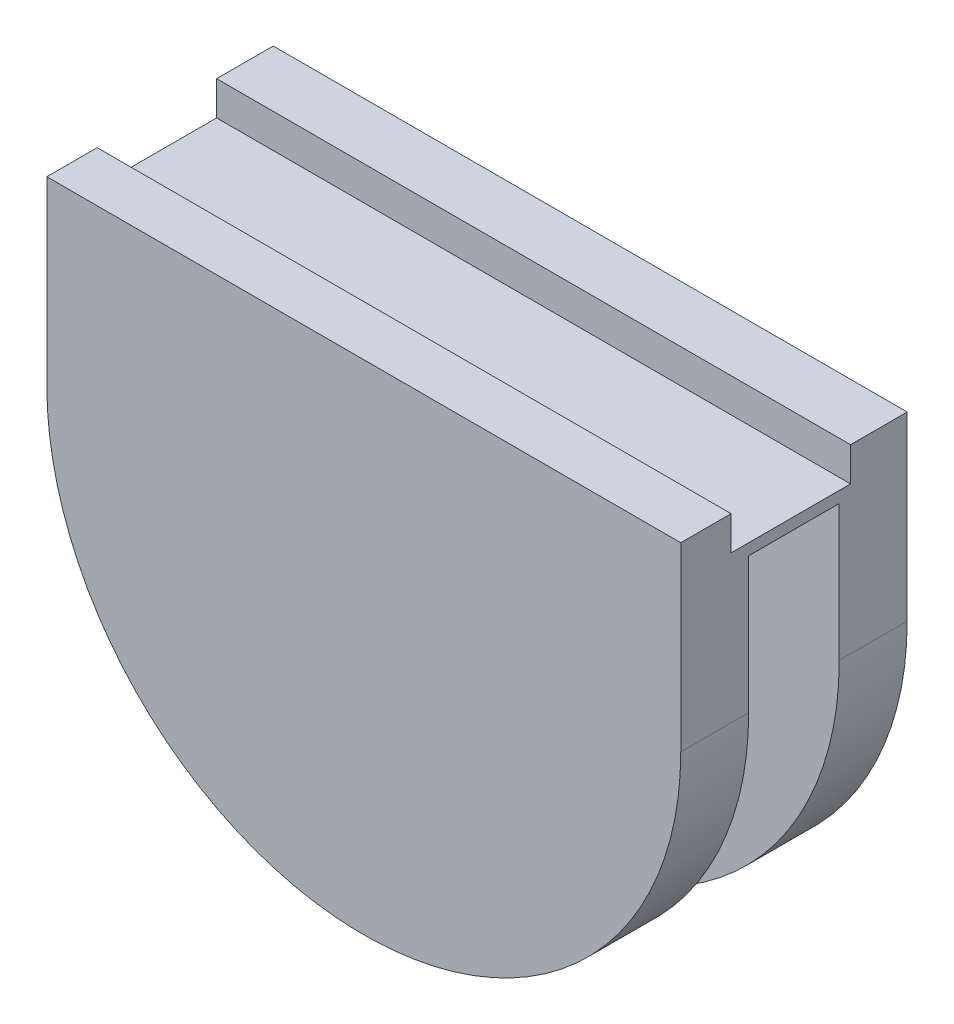
ISO-10303-21;
HEADER;
FILE_DESCRIPTION(('STEP AP214'),'2;1');
FILE_NAME('part.step','',(''),(''),'','','');
FILE_SCHEMA(('AUTOMOTIVE_DESIGN { 1 0 10303 214 1 1 1 1 }'));
ENDSEC;
DATA;
#1=APPLICATION_CONTEXT('core data for automotive mechanical design processes');
#2=APPLICATION_PROTOCOL_DEFINITION('international standard','automotive_design',2000,#1);
#3=PRODUCT_CONTEXT('',#1,'mechanical');
#4=PRODUCT('Part','Part','',(#3));
#5=PRODUCT_RELATED_PRODUCT_CATEGORY('part','',(#4));
#6=PRODUCT_DEFINITION_FORMATION('','',#4);
#7=PRODUCT_DEFINITION_CONTEXT('part definition',#1,'design');
#8=PRODUCT_DEFINITION('design','',#6,#7);
#9=PRODUCT_DEFINITION_SHAPE('','',#8);
#10=(LENGTH_UNIT() NAMED_UNIT(*) SI_UNIT(.MILLI.,.METRE.));
#11=(NAMED_UNIT(*) PLANE_ANGLE_UNIT() SI_UNIT($,.RADIAN.));
#12=(NAMED_UNIT(*) SI_UNIT($,.STERADIAN.) SOLID_ANGLE_UNIT());
#13=UNCERTAINTY_MEASURE_WITH_UNIT(LENGTH_MEASURE(1.E-05),#10,'distance_accuracy_value','');
#14=(GEOMETRIC_REPRESENTATION_CONTEXT(3) GLOBAL_UNCERTAINTY_ASSIGNED_CONTEXT((#13)) GLOBAL_UNIT_ASSIGNED_CONTEXT((#10,
#11,#12)) REPRESENTATION_CONTEXT('',''));
#15=CARTESIAN_POINT('',(0.,0.,0.));
#16=DIRECTION('',(0.,0.,1.));
#17=DIRECTION('',(1.,0.,0.));
#18=AXIS2_PLACEMENT_3D('',#15,#16,#17);
#19=CARTESIAN_POINT('',(-26.0744927753238,2.89196675900277,3.));
#20=DIRECTION('',(0.,-1.,0.));
#21=DIRECTION('',(0.,0.,-1.));
#22=AXIS2_PLACEMENT_3D('',#19,#20,#21);
#23=PLANE('',#22);
#24=DIRECTION('',(0.,0.,-1.));
#25=VECTOR('',#24,1.);
#26=CARTESIAN_POINT('',(-26.0744927753238,2.89196675900277,3.));
#27=LINE('',#26,#25);
#28=CARTESIAN_POINT('',(-26.0744927753238,2.89196675900277,-4.5));
#29=VERTEX_POINT('',#28);
#30=CARTESIAN_POINT('',(-26.0744927753238,2.89196675900277,-7.));
#31=VERTEX_POINT('',#30);
#32=EDGE_CURVE('E215',#29,#31,#27,.T.);
#33=ORIENTED_EDGE('',*,*,#32,.F.);
#34=DIRECTION('',(-1.,0.,0.));
#35=VECTOR('',#34,1.);
#36=CARTESIAN_POINT('',(-26.0744927753238,2.89196675900277,-4.5));
#37=LINE('',#36,#35);
#38=CARTESIAN_POINT('',(1.9255072246762,2.89196675900277,-4.5));
#39=VERTEX_POINT('',#38);
#40=EDGE_CURVE('E141',#39,#29,#37,.T.);
#41=ORIENTED_EDGE('',*,*,#40,.F.);
#42=DIRECTION('',(0.,0.,-1.));
#43=VECTOR('',#42,1.);
#44=CARTESIAN_POINT('',(1.9255072246762,2.89196675900277,3.));
#45=LINE('',#44,#43);
#46=CARTESIAN_POINT('',(1.9255072246762,2.89196675900277,-7.));
#47=VERTEX_POINT('',#46);
#48=EDGE_CURVE('E222',#39,#47,#45,.T.);
#49=ORIENTED_EDGE('',*,*,#48,.T.);
#50=DIRECTION('',(1.,0.,0.));
#51=VECTOR('',#50,1.);
#52=CARTESIAN_POINT('',(1.9255072246762,2.89196675900277,-7.));
#53=LINE('',#52,#51);
#54=EDGE_CURVE('E180',#31,#47,#53,.T.);
#55=ORIENTED_EDGE('',*,*,#54,.F.);
#56=EDGE_LOOP('',(#33,#41,#49,#55));
#57=FACE_BOUND('',#56,.T.);
#58=ADVANCED_FACE('F46',(#57),#23,.F.);
#59=CARTESIAN_POINT('',(-12.0744927753238,-5.10803324099723,0.));
#60=DIRECTION('',(0.,0.,1.));
#61=DIRECTION('',(1.,0.,0.));
#62=AXIS2_PLACEMENT_3D('',#59,#60,#61);
#63=PLANE('',#62);
#64=DIRECTION('',(-1.,0.,0.));
#65=VECTOR('',#64,1.);
#66=CARTESIAN_POINT('',(1.9255072246762,0.891966759002768,0.));
#67=LINE('',#66,#65);
#68=CARTESIAN_POINT('',(1.9255072246762,0.891966759002769,0.));
#69=VERTEX_POINT('',#68);
#70=CARTESIAN_POINT('',(-26.0744927753238,0.891966759002769,0.));
#71=VERTEX_POINT('',#70);
#72=EDGE_CURVE('E69',#69,#71,#67,.T.);
#73=ORIENTED_EDGE('',*,*,#72,.F.);
#74=DIRECTION('',(0.,1.,0.));
#75=VECTOR('',#74,1.);
#76=CARTESIAN_POINT('',(1.9255072246762,2.89196675900277,0.));
#77=LINE('',#76,#75);
#78=CARTESIAN_POINT('',(1.9255072246762,-5.10803324099723,0.));
#79=VERTEX_POINT('',#78);
#80=EDGE_CURVE('E209',#79,#69,#77,.T.);
#81=ORIENTED_EDGE('',*,*,#80,.F.);
#82=CARTESIAN_POINT('',(-12.0744927753238,-5.10803324099723,0.));
#83=DIRECTION('',(0.,0.,1.));
#84=DIRECTION('',(1.,0.,0.));
#85=AXIS2_PLACEMENT_3D('',#82,#83,#84);
#86=CIRCLE('',#85,14.);
#87=CARTESIAN_POINT('',(-26.0744927753238,-5.10803324099723,0.));
#88=VERTEX_POINT('',#87);
#89=EDGE_CURVE('E217',#88,#79,#86,.T.);
#90=ORIENTED_EDGE('',*,*,#89,.F.);
#91=DIRECTION('',(0.,-1.,0.));
#92=VECTOR('',#91,1.);
#93=CARTESIAN_POINT('',(-26.0744927753238,-5.10803324099724,0.));
#94=LINE('',#93,#92);
#95=EDGE_CURVE('E204',#71,#88,#94,.T.);
#96=ORIENTED_EDGE('',*,*,#95,.F.);
#97=EDGE_LOOP('',(#73,#81,#90,#96));
#98=FACE_BOUND('',#97,.T.);
#99=ADVANCED_FACE('F234',(#98),#63,.F.);
#100=CARTESIAN_POINT('',(-26.0744927753238,-5.10803324099724,3.));
#101=DIRECTION('',(1.,0.,0.));
#102=DIRECTION('',(0.,0.,-1.));
#103=AXIS2_PLACEMENT_3D('',#100,#101,#102);
#104=PLANE('',#103);
#105=DIRECTION('',(0.,0.,1.));
#106=VECTOR('',#105,1.);
#107=CARTESIAN_POINT('',(-26.0744927753238,1.39196675900277,0.776937716866147));
#108=LINE('',#107,#106);
#109=CARTESIAN_POINT('',(-26.0744927753238,1.39196675900277,-4.5));
#110=VERTEX_POINT('',#109);
#111=CARTESIAN_POINT('',(-26.0744927753238,1.39196675900277,0.776937716866147));
#112=VERTEX_POINT('',#111);
#113=EDGE_CURVE('E151',#110,#112,#108,.T.);
#114=ORIENTED_EDGE('',*,*,#113,.F.);
#115=DIRECTION('',(0.,1.,0.));
#116=VECTOR('',#115,1.);
#117=CARTESIAN_POINT('',(-26.0744927753238,1.39196675900277,-4.5));
#118=LINE('',#117,#116);
#119=EDGE_CURVE('E135',#110,#29,#118,.T.);
#120=ORIENTED_EDGE('',*,*,#119,.T.);
#121=ORIENTED_EDGE('',*,*,#32,.T.);
#122=DIRECTION('',(0.,1.,0.));
#123=VECTOR('',#122,1.);
#124=CARTESIAN_POINT('',(-26.0744927753238,2.89196675900277,-7.));
#125=LINE('',#124,#123);
#126=CARTESIAN_POINT('',(-26.0744927753238,-5.10803324099723,-7.));
#127=VERTEX_POINT('',#126);
#128=EDGE_CURVE('E177',#127,#31,#125,.T.);
#129=ORIENTED_EDGE('',*,*,#128,.F.);
#130=DIRECTION('',(0.,0.,1.));
#131=VECTOR('',#130,1.);
#132=CARTESIAN_POINT('',(-26.0744927753238,-5.10803324099723,-7.));
#133=LINE('',#132,#131);
#134=CARTESIAN_POINT('',(-26.0744927753238,-5.10803324099723,-4.));
#135=VERTEX_POINT('',#134);
#136=EDGE_CURVE('E183',#127,#135,#133,.T.);
#137=ORIENTED_EDGE('',*,*,#136,.T.);
#138=DIRECTION('',(0.,1.,0.));
#139=VECTOR('',#138,1.);
#140=CARTESIAN_POINT('',(-26.0744927753238,2.89196675900277,-4.));
#141=LINE('',#140,#139);
#142=CARTESIAN_POINT('',(-26.0744927753238,0.891966759002769,-4.));
#143=VERTEX_POINT('',#142);
#144=EDGE_CURVE('E175',#135,#143,#141,.T.);
#145=ORIENTED_EDGE('',*,*,#144,.T.);
#146=DIRECTION('',(0.,0.,1.));
#147=VECTOR('',#146,1.);
#148=CARTESIAN_POINT('',(-26.0744927753238,0.891966759002769,-4.));
#149=LINE('',#148,#147);
#150=EDGE_CURVE('E197',#143,#71,#149,.T.);
#151=ORIENTED_EDGE('',*,*,#150,.T.);
#152=ORIENTED_EDGE('',*,*,#95,.T.);
#153=DIRECTION('',(0.,0.,-1.));
#154=VECTOR('',#153,1.);
#155=CARTESIAN_POINT('',(-26.0744927753238,-5.10803324099723,3.));
#156=LINE('',#155,#154);
#157=CARTESIAN_POINT('',(-26.0744927753238,-5.10803324099723,3.));
#158=VERTEX_POINT('',#157);
#159=EDGE_CURVE('E13',#158,#88,#156,.T.);
#160=ORIENTED_EDGE('',*,*,#159,.F.);
#161=DIRECTION('',(0.,-1.,0.));
#162=VECTOR('',#161,1.);
#163=CARTESIAN_POINT('',(-26.0744927753238,-5.10803324099724,3.));
#164=LINE('',#163,#162);
#165=CARTESIAN_POINT('',(-26.0744927753238,2.89196675900277,3.));
#166=VERTEX_POINT('',#165);
#167=EDGE_CURVE('E205',#166,#158,#164,.T.);
#168=ORIENTED_EDGE('',*,*,#167,.F.);
#169=CARTESIAN_POINT('',(-26.0744927753238,2.89196675900277,0.776937716866147));
#170=VERTEX_POINT('',#169);
#171=EDGE_CURVE('E220',#166,#170,#27,.T.);
#172=ORIENTED_EDGE('',*,*,#171,.T.);
#173=DIRECTION('',(0.,1.,0.));
#174=VECTOR('',#173,1.);
#175=CARTESIAN_POINT('',(-26.0744927753238,1.39196675900277,0.776937716866147));
#176=LINE('',#175,#174);
#177=EDGE_CURVE('E61',#112,#170,#176,.T.);
#178=ORIENTED_EDGE('',*,*,#177,.F.);
#179=EDGE_LOOP('',(#114,#120,#121,#129,#137,#145,#151,#152,#160,#168,#172,#178));
#180=FACE_BOUND('',#179,.T.);
#181=ADVANCED_FACE('F48',(#180),#104,.F.);
#182=CARTESIAN_POINT('',(-12.0744927753238,-5.10803324099723,3.));
#183=DIRECTION('',(0.,0.,-1.));
#184=DIRECTION('',(-1.,0.,0.));
#185=AXIS2_PLACEMENT_3D('',#182,#183,#184);
#186=CYLINDRICAL_SURFACE('',#185,14.);
#187=ORIENTED_EDGE('',*,*,#89,.T.);
#188=DIRECTION('',(0.,0.,-1.));
#189=VECTOR('',#188,1.);
#190=CARTESIAN_POINT('',(1.9255072246762,-5.10803324099723,3.));
#191=LINE('',#190,#189);
#192=CARTESIAN_POINT('',(1.9255072246762,-5.10803324099723,3.));
#193=VERTEX_POINT('',#192);
#194=EDGE_CURVE('E54',#193,#79,#191,.T.);
#195=ORIENTED_EDGE('',*,*,#194,.F.);
#196=CARTESIAN_POINT('',(-12.0744927753238,-5.10803324099723,3.));
#197=DIRECTION('',(0.,0.,1.));
#198=DIRECTION('',(1.,0.,0.));
#199=AXIS2_PLACEMENT_3D('',#196,#197,#198);
#200=CIRCLE('',#199,14.);
#201=EDGE_CURVE('E208',#158,#193,#200,.T.);
#202=ORIENTED_EDGE('',*,*,#201,.F.);
#203=ORIENTED_EDGE('',*,*,#159,.T.);
#204=EDGE_LOOP('',(#187,#195,#202,#203));
#205=FACE_BOUND('',#204,.T.);
#206=ADVANCED_FACE('F236',(#205),#186,.T.);
#207=CARTESIAN_POINT('',(1.9255072246762,2.89196675900277,3.));
#208=DIRECTION('',(-1.,0.,0.));
#209=DIRECTION('',(0.,-1.,0.));
#210=AXIS2_PLACEMENT_3D('',#207,#208,#209);
#211=PLANE('',#210);
#212=ORIENTED_EDGE('',*,*,#48,.F.);
#213=DIRECTION('',(0.,1.,0.));
#214=VECTOR('',#213,1.);
#215=CARTESIAN_POINT('',(1.9255072246762,1.39196675900277,-4.5));
#216=LINE('',#215,#214);
#217=CARTESIAN_POINT('',(1.9255072246762,1.39196675900277,-4.5));
#218=VERTEX_POINT('',#217);
#219=EDGE_CURVE('E164',#218,#39,#216,.T.);
#220=ORIENTED_EDGE('',*,*,#219,.F.);
#221=DIRECTION('',(0.,0.,-1.));
#222=VECTOR('',#221,1.);
#223=CARTESIAN_POINT('',(1.9255072246762,1.39196675900277,-4.5));
#224=LINE('',#223,#222);
#225=CARTESIAN_POINT('',(1.9255072246762,1.39196675900277,0.776937716866147));
#226=VERTEX_POINT('',#225);
#227=EDGE_CURVE('E145',#226,#218,#224,.T.);
#228=ORIENTED_EDGE('',*,*,#227,.F.);
#229=DIRECTION('',(0.,1.,0.));
#230=VECTOR('',#229,1.);
#231=CARTESIAN_POINT('',(1.9255072246762,1.39196675900277,0.776937716866147));
#232=LINE('',#231,#230);
#233=CARTESIAN_POINT('',(1.9255072246762,2.89196675900277,0.776937716866147));
#234=VERTEX_POINT('',#233);
#235=EDGE_CURVE('E167',#226,#234,#232,.T.);
#236=ORIENTED_EDGE('',*,*,#235,.T.);
#237=CARTESIAN_POINT('',(1.9255072246762,2.89196675900277,3.));
#238=VERTEX_POINT('',#237);
#239=EDGE_CURVE('E223',#238,#234,#45,.T.);
#240=ORIENTED_EDGE('',*,*,#239,.F.);
#241=DIRECTION('',(0.,1.,0.));
#242=VECTOR('',#241,1.);
#243=CARTESIAN_POINT('',(1.9255072246762,2.89196675900277,3.));
#244=LINE('',#243,#242);
#245=EDGE_CURVE('E211',#193,#238,#244,.T.);
#246=ORIENTED_EDGE('',*,*,#245,.F.);
#247=ORIENTED_EDGE('',*,*,#194,.T.);
#248=ORIENTED_EDGE('',*,*,#80,.T.);
#249=DIRECTION('',(0.,0.,1.));
#250=VECTOR('',#249,1.);
#251=CARTESIAN_POINT('',(1.9255072246762,0.891966759002768,-4.));
#252=LINE('',#251,#250);
#253=CARTESIAN_POINT('',(1.9255072246762,0.891966759002768,-4.));
#254=VERTEX_POINT('',#253);
#255=EDGE_CURVE('E201',#254,#69,#252,.T.);
#256=ORIENTED_EDGE('',*,*,#255,.F.);
#257=DIRECTION('',(0.,-1.,0.));
#258=VECTOR('',#257,1.);
#259=CARTESIAN_POINT('',(1.9255072246762,-5.10803324099723,-4.));
#260=LINE('',#259,#258);
#261=CARTESIAN_POINT('',(1.9255072246762,-5.10803324099723,-4.));
#262=VERTEX_POINT('',#261);
#263=EDGE_CURVE('E166',#254,#262,#260,.T.);
#264=ORIENTED_EDGE('',*,*,#263,.T.);
#265=DIRECTION('',(0.,0.,1.));
#266=VECTOR('',#265,1.);
#267=CARTESIAN_POINT('',(1.9255072246762,-5.10803324099723,-7.));
#268=LINE('',#267,#266);
#269=CARTESIAN_POINT('',(1.9255072246762,-5.10803324099723,-7.));
#270=VERTEX_POINT('',#269);
#271=EDGE_CURVE('E191',#270,#262,#268,.T.);
#272=ORIENTED_EDGE('',*,*,#271,.F.);
#273=DIRECTION('',(0.,-1.,0.));
#274=VECTOR('',#273,1.);
#275=CARTESIAN_POINT('',(1.9255072246762,-5.10803324099723,-7.));
#276=LINE('',#275,#274);
#277=EDGE_CURVE('E171',#47,#270,#276,.T.);
#278=ORIENTED_EDGE('',*,*,#277,.F.);
#279=EDGE_LOOP('',(#212,#220,#228,#236,#240,#246,#247,#248,#256,#264,#272,#278));
#280=FACE_BOUND('',#279,.T.);
#281=ADVANCED_FACE('F230',(#280),#211,.F.);
#282=ORIENTED_EDGE('',*,*,#239,.T.);
#283=DIRECTION('',(1.,0.,0.));
#284=VECTOR('',#283,1.);
#285=CARTESIAN_POINT('',(1.9255072246762,2.89196675900277,0.776937716866147));
#286=LINE('',#285,#284);
#287=EDGE_CURVE('E154',#170,#234,#286,.T.);
#288=ORIENTED_EDGE('',*,*,#287,.F.);
#289=ORIENTED_EDGE('',*,*,#171,.F.);
#290=DIRECTION('',(-1.,0.,0.));
#291=VECTOR('',#290,1.);
#292=CARTESIAN_POINT('',(-26.0744927753238,2.89196675900277,3.));
#293=LINE('',#292,#291);
#294=EDGE_CURVE('E213',#238,#166,#293,.T.);
#295=ORIENTED_EDGE('',*,*,#294,.F.);
#296=EDGE_LOOP('',(#282,#288,#289,#295));
#297=FACE_BOUND('',#296,.T.);
#298=ADVANCED_FACE('F258',(#297),#23,.F.);
#299=CARTESIAN_POINT('',(-12.0744927753238,-5.10803324099723,3.));
#300=DIRECTION('',(0.,0.,1.));
#301=DIRECTION('',(1.,0.,0.));
#302=AXIS2_PLACEMENT_3D('',#299,#300,#301);
#303=PLANE('',#302);
#304=ORIENTED_EDGE('',*,*,#167,.T.);
#305=ORIENTED_EDGE('',*,*,#201,.T.);
#306=ORIENTED_EDGE('',*,*,#245,.T.);
#307=ORIENTED_EDGE('',*,*,#294,.T.);
#308=EDGE_LOOP('',(#304,#305,#306,#307));
#309=FACE_BOUND('',#308,.T.);
#310=ADVANCED_FACE('F261',(#309),#303,.T.);
#311=CARTESIAN_POINT('',(1.9255072246762,0.891966759002768,-4.));
#312=DIRECTION('',(0.,1.,0.));
#313=DIRECTION('',(-1.,0.,0.));
#314=AXIS2_PLACEMENT_3D('',#311,#312,#313);
#315=PLANE('',#314);
#316=ORIENTED_EDGE('',*,*,#72,.T.);
#317=ORIENTED_EDGE('',*,*,#150,.F.);
#318=DIRECTION('',(-1.,0.,0.));
#319=VECTOR('',#318,1.);
#320=CARTESIAN_POINT('',(1.9255072246762,0.891966759002768,-4.));
#321=LINE('',#320,#319);
#322=EDGE_CURVE('E194',#254,#143,#321,.T.);
#323=ORIENTED_EDGE('',*,*,#322,.F.);
#324=ORIENTED_EDGE('',*,*,#255,.T.);
#325=EDGE_LOOP('',(#316,#317,#323,#324));
#326=FACE_BOUND('',#325,.T.);
#327=ADVANCED_FACE('F241',(#326),#315,.F.);
#328=CARTESIAN_POINT('',(-12.0744927753238,-5.10803324099723,-4.));
#329=DIRECTION('',(0.,0.,-1.));
#330=DIRECTION('',(-1.,0.,0.));
#331=AXIS2_PLACEMENT_3D('',#328,#329,#330);
#332=PLANE('',#331);
#333=ORIENTED_EDGE('',*,*,#263,.F.);
#334=ORIENTED_EDGE('',*,*,#322,.T.);
#335=ORIENTED_EDGE('',*,*,#144,.F.);
#336=CARTESIAN_POINT('',(-12.0744927753238,-5.10803324099723,-4.));
#337=DIRECTION('',(0.,0.,-1.));
#338=DIRECTION('',(-1.,0.,0.));
#339=AXIS2_PLACEMENT_3D('',#336,#337,#338);
#340=CIRCLE('',#339,14.);
#341=EDGE_CURVE('E185',#262,#135,#340,.T.);
#342=ORIENTED_EDGE('',*,*,#341,.F.);
#343=EDGE_LOOP('',(#333,#334,#335,#342));
#344=FACE_BOUND('',#343,.T.);
#345=ADVANCED_FACE('F244',(#344),#332,.F.);
#346=CARTESIAN_POINT('',(-12.0744927753238,-5.10803324099723,-7.));
#347=DIRECTION('',(0.,0.,1.));
#348=DIRECTION('',(1.,0.,0.));
#349=AXIS2_PLACEMENT_3D('',#346,#347,#348);
#350=CYLINDRICAL_SURFACE('',#349,14.);
#351=ORIENTED_EDGE('',*,*,#341,.T.);
#352=ORIENTED_EDGE('',*,*,#136,.F.);
#353=CARTESIAN_POINT('',(-12.0744927753238,-5.10803324099723,-7.));
#354=DIRECTION('',(0.,0.,-1.));
#355=DIRECTION('',(-1.,0.,0.));
#356=AXIS2_PLACEMENT_3D('',#353,#354,#355);
#357=CIRCLE('',#356,14.);
#358=EDGE_CURVE('E174',#270,#127,#357,.T.);
#359=ORIENTED_EDGE('',*,*,#358,.F.);
#360=ORIENTED_EDGE('',*,*,#271,.T.);
#361=EDGE_LOOP('',(#351,#352,#359,#360));
#362=FACE_BOUND('',#361,.T.);
#363=ADVANCED_FACE('F249',(#362),#350,.T.);
#364=CARTESIAN_POINT('',(-12.0744927753238,-5.10803324099723,-7.));
#365=DIRECTION('',(0.,0.,-1.));
#366=DIRECTION('',(-1.,0.,0.));
#367=AXIS2_PLACEMENT_3D('',#364,#365,#366);
#368=PLANE('',#367);
#369=ORIENTED_EDGE('',*,*,#277,.T.);
#370=ORIENTED_EDGE('',*,*,#358,.T.);
#371=ORIENTED_EDGE('',*,*,#128,.T.);
#372=ORIENTED_EDGE('',*,*,#54,.T.);
#373=EDGE_LOOP('',(#369,#370,#371,#372));
#374=FACE_BOUND('',#373,.T.);
#375=ADVANCED_FACE('F253',(#374),#368,.T.);
#376=CARTESIAN_POINT('',(-26.0744927753238,1.39196675900277,-4.5));
#377=DIRECTION('',(0.,0.,-1.));
#378=DIRECTION('',(-1.,0.,0.));
#379=AXIS2_PLACEMENT_3D('',#376,#377,#378);
#380=PLANE('',#379);
#381=ORIENTED_EDGE('',*,*,#40,.T.);
#382=ORIENTED_EDGE('',*,*,#119,.F.);
#383=DIRECTION('',(-1.,0.,0.));
#384=VECTOR('',#383,1.);
#385=CARTESIAN_POINT('',(-26.0744927753238,1.39196675900277,-4.5));
#386=LINE('',#385,#384);
#387=EDGE_CURVE('E138',#218,#110,#386,.T.);
#388=ORIENTED_EDGE('',*,*,#387,.F.);
#389=ORIENTED_EDGE('',*,*,#219,.T.);
#390=EDGE_LOOP('',(#381,#382,#388,#389));
#391=FACE_BOUND('',#390,.T.);
#392=ADVANCED_FACE('F137',(#391),#380,.F.);
#393=CARTESIAN_POINT('',(1.9255072246762,1.39196675900277,0.776937716866147));
#394=DIRECTION('',(0.,0.,1.));
#395=DIRECTION('',(1.,0.,0.));
#396=AXIS2_PLACEMENT_3D('',#393,#394,#395);
#397=PLANE('',#396);
#398=ORIENTED_EDGE('',*,*,#287,.T.);
#399=ORIENTED_EDGE('',*,*,#235,.F.);
#400=DIRECTION('',(1.,0.,0.));
#401=VECTOR('',#400,1.);
#402=CARTESIAN_POINT('',(1.9255072246762,1.39196675900277,0.776937716866147));
#403=LINE('',#402,#401);
#404=EDGE_CURVE('E157',#112,#226,#403,.T.);
#405=ORIENTED_EDGE('',*,*,#404,.F.);
#406=ORIENTED_EDGE('',*,*,#177,.T.);
#407=EDGE_LOOP('',(#398,#399,#405,#406));
#408=FACE_BOUND('',#407,.T.);
#409=ADVANCED_FACE('F341',(#408),#397,.F.);
#410=CARTESIAN_POINT('',(0.,1.39196675900277,0.));
#411=DIRECTION('',(0.,-1.,0.));
#412=DIRECTION('',(0.,0.,-1.));
#413=AXIS2_PLACEMENT_3D('',#410,#411,#412);
#414=PLANE('',#413);
#415=ORIENTED_EDGE('',*,*,#387,.T.);
#416=ORIENTED_EDGE('',*,*,#113,.T.);
#417=ORIENTED_EDGE('',*,*,#404,.T.);
#418=ORIENTED_EDGE('',*,*,#227,.T.);
#419=EDGE_LOOP('',(#415,#416,#417,#418));
#420=FACE_BOUND('',#419,.T.);
#421=ADVANCED_FACE('F149',(#420),#414,.F.);
#422=CLOSED_SHELL('',(#58,#99,#181,#206,#281,#298,#310,#327,#345,#363,#375,#392,#409,#421));
#423=MANIFOLD_SOLID_BREP('B2',#422);
#424=ADVANCED_BREP_SHAPE_REPRESENTATION('',(#18,#423),#14);
#425=SHAPE_DEFINITION_REPRESENTATION(#9,#424);
ENDSEC;
END-ISO-10303-21;
